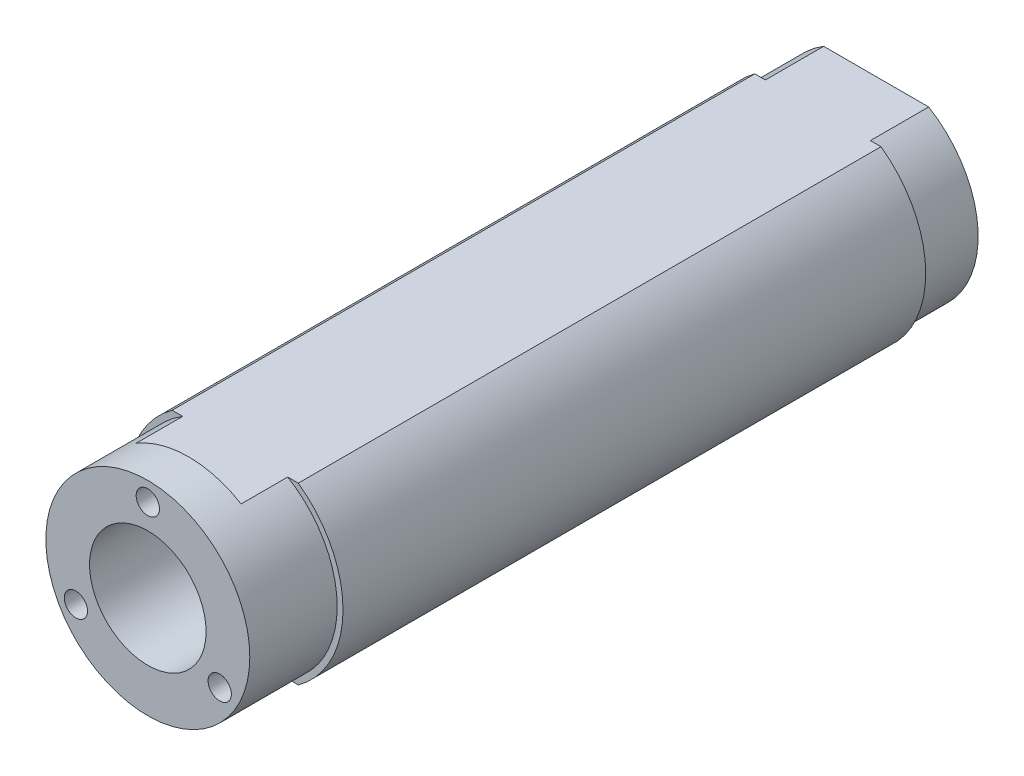
ISO-10303-21;
HEADER;
FILE_DESCRIPTION(('STEP AP214'),'2;1');
FILE_NAME('part.step','',(''),(''),'','','');
FILE_SCHEMA(('AUTOMOTIVE_DESIGN { 1 0 10303 214 1 1 1 1 }'));
ENDSEC;
DATA;
#1=APPLICATION_CONTEXT('core data for automotive mechanical design processes');
#2=APPLICATION_PROTOCOL_DEFINITION('international standard','automotive_design',2000,#1);
#3=PRODUCT_CONTEXT('',#1,'mechanical');
#4=PRODUCT('Part','Part','',(#3));
#5=PRODUCT_RELATED_PRODUCT_CATEGORY('part','',(#4));
#6=PRODUCT_DEFINITION_FORMATION('','',#4);
#7=PRODUCT_DEFINITION_CONTEXT('part definition',#1,'design');
#8=PRODUCT_DEFINITION('design','',#6,#7);
#9=PRODUCT_DEFINITION_SHAPE('','',#8);
#10=(LENGTH_UNIT() NAMED_UNIT(*) SI_UNIT(.MILLI.,.METRE.));
#11=(NAMED_UNIT(*) PLANE_ANGLE_UNIT() SI_UNIT($,.RADIAN.));
#12=(NAMED_UNIT(*) SI_UNIT($,.STERADIAN.) SOLID_ANGLE_UNIT());
#13=UNCERTAINTY_MEASURE_WITH_UNIT(LENGTH_MEASURE(1.E-05),#10,'distance_accuracy_value','');
#14=(GEOMETRIC_REPRESENTATION_CONTEXT(3) GLOBAL_UNCERTAINTY_ASSIGNED_CONTEXT((#13)) GLOBAL_UNIT_ASSIGNED_CONTEXT((#10,
#11,#12)) REPRESENTATION_CONTEXT('',''));
#15=CARTESIAN_POINT('',(0.,0.,0.));
#16=DIRECTION('',(0.,0.,1.));
#17=DIRECTION('',(1.,0.,0.));
#18=AXIS2_PLACEMENT_3D('',#15,#16,#17);
#19=CARTESIAN_POINT('',(0.,15.,-60.));
#20=DIRECTION('',(0.,-1.,0.));
#21=DIRECTION('',(0.,0.,-1.));
#22=AXIS2_PLACEMENT_3D('',#19,#20,#21);
#23=PLANE('',#22);
#24=DIRECTION('',(-1.,0.,0.));
#25=VECTOR('',#24,1.);
#26=CARTESIAN_POINT('',(0.,15.,58.));
#27=LINE('',#26,#25);
#28=CARTESIAN_POINT('',(9.01387818865998,15.,58.));
#29=VERTEX_POINT('',#28);
#30=CARTESIAN_POINT('',(-9.01387818865998,15.,58.));
#31=VERTEX_POINT('',#30);
#32=EDGE_CURVE('E65',#29,#31,#27,.T.);
#33=ORIENTED_EDGE('',*,*,#32,.F.);
#34=DIRECTION('',(0.,0.,1.));
#35=VECTOR('',#34,1.);
#36=CARTESIAN_POINT('',(9.01387818865998,15.,-60.));
#37=LINE('',#36,#35);
#38=CARTESIAN_POINT('',(9.01387818865998,15.,50.));
#39=VERTEX_POINT('',#38);
#40=EDGE_CURVE('E57',#39,#29,#37,.T.);
#41=ORIENTED_EDGE('',*,*,#40,.F.);
#42=DIRECTION('',(1.,0.,0.));
#43=VECTOR('',#42,1.);
#44=CARTESIAN_POINT('',(0.,15.,50.));
#45=LINE('',#44,#43);
#46=CARTESIAN_POINT('',(10.8282039138539,15.,50.));
#47=VERTEX_POINT('',#46);
#48=EDGE_CURVE('E206',#39,#47,#45,.T.);
#49=ORIENTED_EDGE('',*,*,#48,.T.);
#50=DIRECTION('',(0.,0.,1.));
#51=VECTOR('',#50,1.);
#52=CARTESIAN_POINT('',(10.8282039138539,15.,-50.));
#53=LINE('',#52,#51);
#54=CARTESIAN_POINT('',(10.8282039138539,15.,-50.));
#55=VERTEX_POINT('',#54);
#56=EDGE_CURVE('E189',#55,#47,#53,.T.);
#57=ORIENTED_EDGE('',*,*,#56,.F.);
#58=DIRECTION('',(1.,0.,0.));
#59=VECTOR('',#58,1.);
#60=CARTESIAN_POINT('',(0.,15.,-50.));
#61=LINE('',#60,#59);
#62=CARTESIAN_POINT('',(9.01387818865998,15.,-50.));
#63=VERTEX_POINT('',#62);
#64=EDGE_CURVE('E195',#63,#55,#61,.T.);
#65=ORIENTED_EDGE('',*,*,#64,.F.);
#66=CARTESIAN_POINT('',(9.01387818865998,15.,-60.));
#67=VERTEX_POINT('',#66);
#68=EDGE_CURVE('E11',#67,#63,#37,.T.);
#69=ORIENTED_EDGE('',*,*,#68,.F.);
#70=DIRECTION('',(1.,0.,0.));
#71=VECTOR('',#70,1.);
#72=CARTESIAN_POINT('',(0.,15.,-60.));
#73=LINE('',#72,#71);
#74=CARTESIAN_POINT('',(-9.01387818865998,15.,-60.));
#75=VERTEX_POINT('',#74);
#76=EDGE_CURVE('E178',#75,#67,#73,.T.);
#77=ORIENTED_EDGE('',*,*,#76,.F.);
#78=DIRECTION('',(0.,0.,1.));
#79=VECTOR('',#78,1.);
#80=CARTESIAN_POINT('',(-9.01387818865998,15.,-60.));
#81=LINE('',#80,#79);
#82=CARTESIAN_POINT('',(-9.01387818865998,15.,-50.));
#83=VERTEX_POINT('',#82);
#84=EDGE_CURVE('E161',#75,#83,#81,.T.);
#85=ORIENTED_EDGE('',*,*,#84,.T.);
#86=DIRECTION('',(1.,0.,0.));
#87=VECTOR('',#86,1.);
#88=CARTESIAN_POINT('',(0.,15.,-50.));
#89=LINE('',#88,#87);
#90=CARTESIAN_POINT('',(-10.8282039138539,15.,-50.));
#91=VERTEX_POINT('',#90);
#92=EDGE_CURVE('E234',#91,#83,#89,.T.);
#93=ORIENTED_EDGE('',*,*,#92,.F.);
#94=DIRECTION('',(0.,0.,-1.));
#95=VECTOR('',#94,1.);
#96=CARTESIAN_POINT('',(-10.8282039138539,15.,50.));
#97=LINE('',#96,#95);
#98=CARTESIAN_POINT('',(-10.8282039138539,15.,50.));
#99=VERTEX_POINT('',#98);
#100=EDGE_CURVE('E215',#99,#91,#97,.T.);
#101=ORIENTED_EDGE('',*,*,#100,.F.);
#102=DIRECTION('',(1.,0.,0.));
#103=VECTOR('',#102,1.);
#104=CARTESIAN_POINT('',(0.,15.,50.));
#105=LINE('',#104,#103);
#106=CARTESIAN_POINT('',(-9.01387818865998,15.,50.));
#107=VERTEX_POINT('',#106);
#108=EDGE_CURVE('E224',#99,#107,#105,.T.);
#109=ORIENTED_EDGE('',*,*,#108,.T.);
#110=EDGE_CURVE('E70',#107,#31,#81,.T.);
#111=ORIENTED_EDGE('',*,*,#110,.T.);
#112=EDGE_LOOP('',(#33,#41,#49,#57,#65,#69,#77,#85,#93,#101,#109,#111));
#113=FACE_BOUND('',#112,.T.);
#114=ADVANCED_FACE('F43',(#113),#23,.F.);
#115=CARTESIAN_POINT('',(0.,-15.,-60.));
#116=DIRECTION('',(0.,-1.,0.));
#117=DIRECTION('',(1.,0.,0.));
#118=AXIS2_PLACEMENT_3D('',#115,#116,#117);
#119=PLANE('',#118);
#120=CARTESIAN_POINT('',(0.,-15.,0.));
#121=DIRECTION('',(0.,-1.,0.));
#122=DIRECTION('',(0.,0.,-1.));
#123=AXIS2_PLACEMENT_3D('',#120,#121,#122);
#124=CIRCLE('',#123,1.525);
#125=CARTESIAN_POINT('',(0.,-15.,-1.525));
#126=VERTEX_POINT('',#125);
#127=EDGE_CURVE('E258',#126,#126,#124,.T.);
#128=ORIENTED_EDGE('',*,*,#127,.F.);
#129=EDGE_LOOP('',(#128));
#130=FACE_BOUND('',#129,.T.);
#131=DIRECTION('',(0.,0.,1.));
#132=VECTOR('',#131,1.);
#133=CARTESIAN_POINT('',(9.01387818865999,-15.,-60.));
#134=LINE('',#133,#132);
#135=CARTESIAN_POINT('',(9.01387818865999,-15.,50.));
#136=VERTEX_POINT('',#135);
#137=CARTESIAN_POINT('',(9.01387818865999,-15.,58.));
#138=VERTEX_POINT('',#137);
#139=EDGE_CURVE('E154',#136,#138,#134,.T.);
#140=ORIENTED_EDGE('',*,*,#139,.T.);
#141=DIRECTION('',(-1.,0.,0.));
#142=VECTOR('',#141,1.);
#143=CARTESIAN_POINT('',(0.,-15.,58.));
#144=LINE('',#143,#142);
#145=CARTESIAN_POINT('',(-9.01387818865998,-15.,58.));
#146=VERTEX_POINT('',#145);
#147=EDGE_CURVE('E140',#138,#146,#144,.T.);
#148=ORIENTED_EDGE('',*,*,#147,.T.);
#149=DIRECTION('',(0.,0.,1.));
#150=VECTOR('',#149,1.);
#151=CARTESIAN_POINT('',(-9.01387818865998,-15.,-60.));
#152=LINE('',#151,#150);
#153=CARTESIAN_POINT('',(-9.01387818865998,-15.,50.));
#154=VERTEX_POINT('',#153);
#155=EDGE_CURVE('E152',#154,#146,#152,.T.);
#156=ORIENTED_EDGE('',*,*,#155,.F.);
#157=DIRECTION('',(1.,0.,0.));
#158=VECTOR('',#157,1.);
#159=CARTESIAN_POINT('',(0.,-15.,50.));
#160=LINE('',#159,#158);
#161=CARTESIAN_POINT('',(-10.8282039138539,-15.,50.));
#162=VERTEX_POINT('',#161);
#163=EDGE_CURVE('E220',#162,#154,#160,.T.);
#164=ORIENTED_EDGE('',*,*,#163,.F.);
#165=DIRECTION('',(0.,0.,-1.));
#166=VECTOR('',#165,1.);
#167=CARTESIAN_POINT('',(-10.8282039138539,-15.,50.));
#168=LINE('',#167,#166);
#169=CARTESIAN_POINT('',(-10.8282039138539,-15.,-50.));
#170=VERTEX_POINT('',#169);
#171=EDGE_CURVE('E217',#162,#170,#168,.T.);
#172=ORIENTED_EDGE('',*,*,#171,.T.);
#173=DIRECTION('',(1.,0.,0.));
#174=VECTOR('',#173,1.);
#175=CARTESIAN_POINT('',(0.,-15.,-50.));
#176=LINE('',#175,#174);
#177=CARTESIAN_POINT('',(-9.01387818865998,-15.,-50.));
#178=VERTEX_POINT('',#177);
#179=EDGE_CURVE('E228',#170,#178,#176,.T.);
#180=ORIENTED_EDGE('',*,*,#179,.T.);
#181=CARTESIAN_POINT('',(-9.01387818865998,-15.,-60.));
#182=VERTEX_POINT('',#181);
#183=EDGE_CURVE('E160',#182,#178,#152,.T.);
#184=ORIENTED_EDGE('',*,*,#183,.F.);
#185=DIRECTION('',(1.,0.,0.));
#186=VECTOR('',#185,1.);
#187=CARTESIAN_POINT('',(0.,-15.,-60.));
#188=LINE('',#187,#186);
#189=CARTESIAN_POINT('',(9.01387818865999,-15.,-60.));
#190=VERTEX_POINT('',#189);
#191=EDGE_CURVE('E172',#182,#190,#188,.T.);
#192=ORIENTED_EDGE('',*,*,#191,.T.);
#193=CARTESIAN_POINT('',(9.01387818865999,-15.,-50.));
#194=VERTEX_POINT('',#193);
#195=EDGE_CURVE('E166',#190,#194,#134,.T.);
#196=ORIENTED_EDGE('',*,*,#195,.T.);
#197=DIRECTION('',(1.,0.,0.));
#198=VECTOR('',#197,1.);
#199=CARTESIAN_POINT('',(0.,-15.,-50.));
#200=LINE('',#199,#198);
#201=CARTESIAN_POINT('',(10.8282039138539,-15.,-50.));
#202=VERTEX_POINT('',#201);
#203=EDGE_CURVE('E200',#194,#202,#200,.T.);
#204=ORIENTED_EDGE('',*,*,#203,.T.);
#205=DIRECTION('',(0.,0.,1.));
#206=VECTOR('',#205,1.);
#207=CARTESIAN_POINT('',(10.8282039138539,-15.,-50.));
#208=LINE('',#207,#206);
#209=CARTESIAN_POINT('',(10.8282039138539,-15.,50.));
#210=VERTEX_POINT('',#209);
#211=EDGE_CURVE('E190',#202,#210,#208,.T.);
#212=ORIENTED_EDGE('',*,*,#211,.T.);
#213=DIRECTION('',(1.,0.,0.));
#214=VECTOR('',#213,1.);
#215=CARTESIAN_POINT('',(0.,-15.,50.));
#216=LINE('',#215,#214);
#217=EDGE_CURVE('E212',#136,#210,#216,.T.);
#218=ORIENTED_EDGE('',*,*,#217,.F.);
#219=EDGE_LOOP('',(#140,#148,#156,#164,#172,#180,#184,#192,#196,#204,#212,#218));
#220=FACE_BOUND('',#219,.T.);
#221=ADVANCED_FACE('F150',(#130,#220),#119,.T.);
#222=CARTESIAN_POINT('',(0.,0.,-60.));
#223=DIRECTION('',(0.,0.,1.));
#224=DIRECTION('',(1.,0.,0.));
#225=AXIS2_PLACEMENT_3D('',#222,#223,#224);
#226=CYLINDRICAL_SURFACE('',#225,17.5);
#227=ORIENTED_EDGE('',*,*,#183,.T.);
#228=CARTESIAN_POINT('',(0.,0.,-50.));
#229=DIRECTION('',(0.,0.,1.));
#230=DIRECTION('',(1.,0.,0.));
#231=AXIS2_PLACEMENT_3D('',#228,#229,#230);
#232=CIRCLE('',#231,17.5);
#233=EDGE_CURVE('E226',#83,#178,#232,.T.);
#234=ORIENTED_EDGE('',*,*,#233,.F.);
#235=ORIENTED_EDGE('',*,*,#84,.F.);
#236=CARTESIAN_POINT('',(0.,0.,-60.));
#237=DIRECTION('',(0.,0.,1.));
#238=DIRECTION('',(1.,0.,0.));
#239=AXIS2_PLACEMENT_3D('',#236,#237,#238);
#240=CIRCLE('',#239,17.5);
#241=EDGE_CURVE('E175',#75,#182,#240,.T.);
#242=ORIENTED_EDGE('',*,*,#241,.T.);
#243=EDGE_LOOP('',(#227,#234,#235,#242));
#244=FACE_BOUND('',#243,.T.);
#245=ADVANCED_FACE('F265',(#244),#226,.T.);
#246=ORIENTED_EDGE('',*,*,#68,.T.);
#247=CARTESIAN_POINT('',(0.,0.,-50.));
#248=DIRECTION('',(0.,0.,1.));
#249=DIRECTION('',(1.,0.,0.));
#250=AXIS2_PLACEMENT_3D('',#247,#248,#249);
#251=CIRCLE('',#250,17.5);
#252=EDGE_CURVE('E192',#194,#63,#251,.T.);
#253=ORIENTED_EDGE('',*,*,#252,.F.);
#254=ORIENTED_EDGE('',*,*,#195,.F.);
#255=CARTESIAN_POINT('',(0.,0.,-60.));
#256=DIRECTION('',(0.,0.,1.));
#257=DIRECTION('',(1.,0.,0.));
#258=AXIS2_PLACEMENT_3D('',#255,#256,#257);
#259=CIRCLE('',#258,17.5);
#260=EDGE_CURVE('E169',#190,#67,#259,.T.);
#261=ORIENTED_EDGE('',*,*,#260,.T.);
#262=EDGE_LOOP('',(#246,#253,#254,#261));
#263=FACE_BOUND('',#262,.T.);
#264=ADVANCED_FACE('F271',(#263),#226,.T.);
#265=CARTESIAN_POINT('',(0.,0.,65.));
#266=DIRECTION('',(0.,0.,1.));
#267=DIRECTION('',(1.,0.,0.));
#268=AXIS2_PLACEMENT_3D('',#265,#266,#267);
#269=CIRCLE('',#268,17.5);
#270=CARTESIAN_POINT('',(17.5,0.,65.));
#271=VERTEX_POINT('',#270);
#272=EDGE_CURVE('E183',#271,#271,#269,.T.);
#273=ORIENTED_EDGE('',*,*,#272,.F.);
#274=EDGE_LOOP('',(#273));
#275=FACE_BOUND('',#274,.T.);
#276=CARTESIAN_POINT('',(0.,0.,58.));
#277=DIRECTION('',(0.,0.,1.));
#278=DIRECTION('',(1.,0.,0.));
#279=AXIS2_PLACEMENT_3D('',#276,#277,#278);
#280=CIRCLE('',#279,17.5);
#281=EDGE_CURVE('E137',#146,#138,#280,.T.);
#282=ORIENTED_EDGE('',*,*,#281,.T.);
#283=ORIENTED_EDGE('',*,*,#139,.F.);
#284=CARTESIAN_POINT('',(0.,0.,50.));
#285=DIRECTION('',(0.,0.,1.));
#286=DIRECTION('',(1.,0.,0.));
#287=AXIS2_PLACEMENT_3D('',#284,#285,#286);
#288=CIRCLE('',#287,17.5);
#289=EDGE_CURVE('E203',#136,#39,#288,.T.);
#290=ORIENTED_EDGE('',*,*,#289,.T.);
#291=ORIENTED_EDGE('',*,*,#40,.T.);
#292=EDGE_CURVE('E145',#29,#31,#280,.T.);
#293=ORIENTED_EDGE('',*,*,#292,.T.);
#294=ORIENTED_EDGE('',*,*,#110,.F.);
#295=CARTESIAN_POINT('',(0.,0.,50.));
#296=DIRECTION('',(0.,0.,1.));
#297=DIRECTION('',(1.,0.,0.));
#298=AXIS2_PLACEMENT_3D('',#295,#296,#297);
#299=CIRCLE('',#298,17.5);
#300=EDGE_CURVE('E159',#107,#154,#299,.T.);
#301=ORIENTED_EDGE('',*,*,#300,.T.);
#302=ORIENTED_EDGE('',*,*,#155,.T.);
#303=EDGE_LOOP('',(#282,#283,#290,#291,#293,#294,#301,#302));
#304=FACE_BOUND('',#303,.T.);
#305=ADVANCED_FACE('F157',(#275,#304),#226,.T.);
#306=CARTESIAN_POINT('',(0.,0.,-60.));
#307=DIRECTION('',(0.,0.,1.));
#308=DIRECTION('',(1.,0.,0.));
#309=AXIS2_PLACEMENT_3D('',#306,#307,#308);
#310=CYLINDRICAL_SURFACE('',#309,10.);
#311=CARTESIAN_POINT('',(0.,-10.,-1.25));
#312=CARTESIAN_POINT('',(0.069920547777883,-9.99999902448215,-1.24999702953214));
#313=CARTESIAN_POINT('',(0.139884787151376,-9.99925892277451,-1.24411356041536));
#314=CARTESIAN_POINT('',(0.277866401044878,-9.9963777005568,-1.2207361227146));
#315=CARTESIAN_POINT('',(0.345881665311874,-9.99423511720715,-1.2032300310383));
#316=CARTESIAN_POINT('',(0.477947787406529,-9.98879030522203,-1.15713117804296));
#317=CARTESIAN_POINT('',(0.542001280073071,-9.98548885727771,-1.12854587909507));
#318=CARTESIAN_POINT('',(0.66438973744652,-9.97809350439049,-1.0611163580151));
#319=CARTESIAN_POINT('',(0.722725680778187,-9.97399973542058,-1.02227389573464));
#320=CARTESIAN_POINT('',(0.83235640846566,-9.96545160653163,-0.935204025080203));
#321=CARTESIAN_POINT('',(0.883615182468564,-9.96099557346209,-0.886931435326879));
#322=CARTESIAN_POINT('',(0.977326396778748,-9.95223863004875,-0.782468588231678));
#323=CARTESIAN_POINT('',(1.01977838819613,-9.94793772762134,-0.726277927543376));
#324=CARTESIAN_POINT('',(1.09480508064197,-9.93996152809793,-0.607340011217166));
#325=CARTESIAN_POINT('',(1.12734604797054,-9.93628838588956,-0.544571319216027));
#326=CARTESIAN_POINT('',(1.18141153828756,-9.93000564228841,-0.414406474026319));
#327=CARTESIAN_POINT('',(1.20293647903261,-9.92739600056568,-0.347010496426492));
#328=CARTESIAN_POINT('',(1.23424949001238,-9.92355169801807,-0.209877902206617));
#329=CARTESIAN_POINT('',(1.24409835736585,-9.92230991718372,-0.140155371147902));
#330=CARTESIAN_POINT('',(1.25196777477862,-9.92132014071396,-3.6868264083025E-05));
#331=CARTESIAN_POINT('',(1.24998880050121,-9.92157208500754,0.0703590763656457));
#332=CARTESIAN_POINT('',(1.23430861822395,-9.92353477684876,0.209402413624391));
#333=CARTESIAN_POINT('',(1.22067438149235,-9.92523718980165,0.278057493100132));
#334=CARTESIAN_POINT('',(1.18217519159103,-9.92989599878815,0.412097510609493));
#335=CARTESIAN_POINT('',(1.15731001087595,-9.93285242022862,0.477482382357019));
#336=CARTESIAN_POINT('',(1.09698277995583,-9.93969557932326,0.603333999510842));
#337=CARTESIAN_POINT('',(1.06149162685382,-9.94358486605722,0.663786650124492));
#338=CARTESIAN_POINT('',(0.98094073472846,-9.95185355715299,0.777903347206623));
#339=CARTESIAN_POINT('',(0.935880558040389,-9.95623298392831,0.83156708298684));
#340=CARTESIAN_POINT('',(0.837099555376891,-9.96502554945213,0.93097135536137));
#341=CARTESIAN_POINT('',(0.783321003920007,-9.96943871193445,0.97665454588299));
#342=CARTESIAN_POINT('',(0.668828584556963,-9.97777316277927,1.05835444001527));
#343=CARTESIAN_POINT('',(0.608114700659127,-9.98169445000753,1.094371121336));
#344=CARTESIAN_POINT('',(0.481430835681742,-9.9886057610929,1.15571566023196));
#345=CARTESIAN_POINT('',(0.41545909766886,-9.99159547200768,1.18103992694061));
#346=CARTESIAN_POINT('',(0.28015397021553,-9.99630392890031,1.22023524676163));
#347=CARTESIAN_POINT('',(0.210820738315335,-9.99802273437935,1.23410683606852));
#348=CARTESIAN_POINT('',(0.0712565819567505,-9.9999879820538,1.24992871213027));
#349=CARTESIAN_POINT('',(0.00103474509930558,-10.0002441807132,1.25195799618203));
#350=CARTESIAN_POINT('',(-0.138748018248746,-9.99928169002715,1.24424613297202));
#351=CARTESIAN_POINT('',(-0.208308958782351,-9.99806303209107,1.2345052363742));
#352=CARTESIAN_POINT('',(-0.344562253860759,-9.99429384378346,1.20359514561281));
#353=CARTESIAN_POINT('',(-0.41126328521235,-9.99174770406934,1.18246361829868));
#354=CARTESIAN_POINT('',(-0.540174827429201,-9.98560861550099,1.12941127404354));
#355=CARTESIAN_POINT('',(-0.602385185732654,-9.98201563110312,1.09749009075428));
#356=CARTESIAN_POINT('',(-0.720902260343711,-9.97415911455056,1.02357343124627));
#357=CARTESIAN_POINT('',(-0.777176879971907,-9.96989222021254,0.981526855097181));
#358=CARTESIAN_POINT('',(-0.881898494813156,-9.96117571162828,0.888625251232897));
#359=CARTESIAN_POINT('',(-0.930345179168426,-9.95672609013449,0.837769873874504));
#360=CARTESIAN_POINT('',(-1.018315979409,-9.94811552731292,0.728346291621429));
#361=CARTESIAN_POINT('',(-1.05778773028396,-9.94395637360664,0.669735826844802));
#362=CARTESIAN_POINT('',(-1.12632644472175,-9.93642705518574,0.546670877572644));
#363=CARTESIAN_POINT('',(-1.15539361686418,-9.93305687465514,0.48221651026174));
#364=CARTESIAN_POINT('',(-1.20221328943327,-9.92749925196498,0.349462340426193));
#365=CARTESIAN_POINT('',(-1.21999531372855,-9.92530872592394,0.281173084976014));
#366=CARTESIAN_POINT('',(-1.24383499693392,-9.92234957953728,0.142548758109667));
#367=CARTESIAN_POINT('',(-1.24989320126788,-9.92158089304389,0.072213782020499));
#368=CARTESIAN_POINT('',(-1.25010326804241,-9.92155438491228,-0.0679844646023398));
#369=CARTESIAN_POINT('',(-1.24433739884963,-9.92228612375977,-0.137847624165945));
#370=CARTESIAN_POINT('',(-1.22123720242466,-9.92515557268601,-0.275603564672539));
#371=CARTESIAN_POINT('',(-1.20390287395288,-9.92729328291541,-0.343496345404398));
#372=CARTESIAN_POINT('',(-1.15818353684482,-9.93273057887275,-0.4753734783832));
#373=CARTESIAN_POINT('',(-1.12980249048546,-9.93602974796392,-0.539359222510907));
#374=CARTESIAN_POINT('',(-1.06280345107515,-9.9434189162241,-0.661673327024157));
#375=CARTESIAN_POINT('',(-1.02418532975479,-9.94750892530207,-0.720001616509913));
#376=CARTESIAN_POINT('',(-0.937503165632915,-9.95605302376117,-0.829765612670236));
#377=CARTESIAN_POINT('',(-0.889377812887475,-9.96050936042017,-0.881152730477488));
#378=CARTESIAN_POINT('',(-0.785175113484188,-9.9692641579645,-0.975153412583985));
#379=CARTESIAN_POINT('',(-0.72909589457078,-9.97356258137795,-1.01776490538716));
#380=CARTESIAN_POINT('',(-0.610332810427102,-9.98153528293373,-1.09314267855265));
#381=CARTESIAN_POINT('',(-0.547624639798082,-9.98520712539151,-1.12587090294963));
#382=CARTESIAN_POINT('',(-0.417591451150638,-9.99148824538363,-1.18028562145814));
#383=CARTESIAN_POINT('',(-0.350271540435115,-9.99409867684788,-1.20198411317673));
#384=CARTESIAN_POINT('',(-0.235502885983959,-9.99733360163873,-1.22852966908565));
#385=CARTESIAN_POINT('',(-0.188777831758457,-9.99832862947727,-1.23656947099103));
#386=CARTESIAN_POINT('',(-0.0947085316062148,-9.99966215664594,-1.24730562284661));
#387=CARTESIAN_POINT('',(-0.0473642902480111,-10.0000006608173,-1.25000201219965));
#388=CARTESIAN_POINT('',(0.,-10.,-1.25));
#389=B_SPLINE_CURVE_WITH_KNOTS('',3,(#311,#312,#313,#314,#315,#316,#317,#318,#319,#320,#321,
#322,#323,#324,#325,#326,#327,#328,#329,#330,#331,#332,#333,#334,#335,#336,#337,#338,#339,#340,
#341,#342,#343,#344,#345,#346,#347,#348,#349,#350,#351,#352,#353,#354,#355,#356,#357,#358,#359,
#360,#361,#362,#363,#364,#365,#366,#367,#368,#369,#370,#371,#372,#373,#374,#375,#376,#377,#378,
#379,#380,#381,#382,#383,#384,#385,#386,#387,#388),.UNSPECIFIED.,.T.,.F.,(4,2,2,2,2,2,2,2,2,2,2,
2,2,2,2,2,2,2,2,2,2,2,2,2,2,2,2,2,2,2,2,2,2,2,2,2,2,2,4),(0.,0.209588636388123,
0.419396230471713,0.629062754090885,0.838693327955365,1.04935406600921,1.26002553900005,
1.47140625159435,1.68277894748403,1.8930461264316,2.10330484942332,2.31236348220846,
2.5214263508312,2.73106713142766,2.94071750256819,3.15181739068208,3.36291776556556,
3.57408897865802,3.7852503045189,3.9950013969596,4.20474802250964,4.41380526946697,
4.62286961539473,4.83301201464211,5.04316275687544,5.25450985753786,5.46585272110769,
5.67664037140462,5.88741821505311,6.09673450601107,6.30605081939774,6.51529212353243,
6.72453604956131,6.93517618845914,7.14586599235006,7.35735701518426,7.56861749342016,
7.71059421593814,7.85256989150218),.UNSPECIFIED.);
#390=CARTESIAN_POINT('',(0.,-10.,-1.25));
#391=VERTEX_POINT('',#390);
#392=EDGE_CURVE('E48',#391,#391,#389,.T.);
#393=ORIENTED_EDGE('',*,*,#392,.T.);
#394=EDGE_LOOP('',(#393));
#395=FACE_BOUND('',#394,.T.);
#396=CARTESIAN_POINT('',(0.,0.,65.));
#397=DIRECTION('',(0.,0.,1.));
#398=DIRECTION('',(1.,0.,0.));
#399=AXIS2_PLACEMENT_3D('',#396,#397,#398);
#400=CIRCLE('',#399,10.);
#401=CARTESIAN_POINT('',(10.,0.,65.));
#402=VERTEX_POINT('',#401);
#403=EDGE_CURVE('E186',#402,#402,#400,.T.);
#404=ORIENTED_EDGE('',*,*,#403,.T.);
#405=EDGE_LOOP('',(#404));
#406=FACE_BOUND('',#405,.T.);
#407=CARTESIAN_POINT('',(0.,0.,-60.));
#408=DIRECTION('',(0.,0.,1.));
#409=DIRECTION('',(1.,0.,0.));
#410=AXIS2_PLACEMENT_3D('',#407,#408,#409);
#411=CIRCLE('',#410,10.);
#412=CARTESIAN_POINT('',(10.,0.,-60.));
#413=VERTEX_POINT('',#412);
#414=EDGE_CURVE('E180',#413,#413,#411,.T.);
#415=ORIENTED_EDGE('',*,*,#414,.F.);
#416=EDGE_LOOP('',(#415));
#417=FACE_BOUND('',#416,.T.);
#418=ADVANCED_FACE('F45',(#395,#406,#417),#310,.F.);
#419=CARTESIAN_POINT('',(0.,0.,-60.));
#420=DIRECTION('',(0.,0.,1.));
#421=DIRECTION('',(1.,0.,0.));
#422=AXIS2_PLACEMENT_3D('',#419,#420,#421);
#423=PLANE('',#422);
#424=ORIENTED_EDGE('',*,*,#414,.T.);
#425=EDGE_LOOP('',(#424));
#426=FACE_BOUND('',#425,.T.);
#427=ORIENTED_EDGE('',*,*,#76,.T.);
#428=ORIENTED_EDGE('',*,*,#260,.F.);
#429=ORIENTED_EDGE('',*,*,#191,.F.);
#430=ORIENTED_EDGE('',*,*,#241,.F.);
#431=EDGE_LOOP('',(#427,#428,#429,#430));
#432=FACE_BOUND('',#431,.T.);
#433=ADVANCED_FACE('F277',(#426,#432),#423,.F.);
#434=CARTESIAN_POINT('',(0.,0.,65.));
#435=DIRECTION('',(0.,0.,1.));
#436=DIRECTION('',(1.,0.,0.));
#437=AXIS2_PLACEMENT_3D('',#434,#435,#436);
#438=PLANE('',#437);
#439=CARTESIAN_POINT('',(0.,14.25,65.));
#440=DIRECTION('',(0.,0.,1.));
#441=DIRECTION('',(1.,0.,0.));
#442=AXIS2_PLACEMENT_3D('',#439,#440,#441);
#443=CIRCLE('',#442,2.);
#444=CARTESIAN_POINT('',(2.,14.25,65.));
#445=VERTEX_POINT('',#444);
#446=EDGE_CURVE('E250',#445,#445,#443,.T.);
#447=ORIENTED_EDGE('',*,*,#446,.F.);
#448=EDGE_LOOP('',(#447));
#449=FACE_BOUND('',#448,.T.);
#450=CARTESIAN_POINT('',(12.3408620039298,-7.12499999999913,65.));
#451=DIRECTION('',(0.,0.,1.));
#452=DIRECTION('',(1.,0.,0.));
#453=AXIS2_PLACEMENT_3D('',#450,#451,#452);
#454=CIRCLE('',#453,2.00000000000126);
#455=CARTESIAN_POINT('',(14.340862003931,-7.12499999999913,65.));
#456=VERTEX_POINT('',#455);
#457=EDGE_CURVE('E244',#456,#456,#454,.T.);
#458=ORIENTED_EDGE('',*,*,#457,.F.);
#459=EDGE_LOOP('',(#458));
#460=FACE_BOUND('',#459,.T.);
#461=CARTESIAN_POINT('',(-12.3408620039267,-7.12500000000088,65.));
#462=DIRECTION('',(0.,0.,1.));
#463=DIRECTION('',(1.,0.,0.));
#464=AXIS2_PLACEMENT_3D('',#461,#462,#463);
#465=CIRCLE('',#464,2.00000000000184);
#466=CARTESIAN_POINT('',(-10.3408620039249,-7.12500000000088,65.));
#467=VERTEX_POINT('',#466);
#468=EDGE_CURVE('E238',#467,#467,#465,.T.);
#469=ORIENTED_EDGE('',*,*,#468,.F.);
#470=EDGE_LOOP('',(#469));
#471=FACE_BOUND('',#470,.T.);
#472=ORIENTED_EDGE('',*,*,#403,.F.);
#473=EDGE_LOOP('',(#472));
#474=FACE_BOUND('',#473,.T.);
#475=ORIENTED_EDGE('',*,*,#272,.T.);
#476=EDGE_LOOP('',(#475));
#477=FACE_BOUND('',#476,.T.);
#478=ADVANCED_FACE('F280',(#449,#460,#471,#474,#477),#438,.T.);
#479=CARTESIAN_POINT('',(0.,0.,-50.));
#480=DIRECTION('',(0.,0.,1.));
#481=DIRECTION('',(1.,0.,0.));
#482=AXIS2_PLACEMENT_3D('',#479,#480,#481);
#483=CYLINDRICAL_SURFACE('',#482,18.5);
#484=CARTESIAN_POINT('',(0.,0.,50.));
#485=DIRECTION('',(0.,0.,1.));
#486=DIRECTION('',(1.,0.,0.));
#487=AXIS2_PLACEMENT_3D('',#484,#485,#486);
#488=CIRCLE('',#487,18.5);
#489=EDGE_CURVE('E209',#210,#47,#488,.T.);
#490=ORIENTED_EDGE('',*,*,#489,.F.);
#491=ORIENTED_EDGE('',*,*,#211,.F.);
#492=CARTESIAN_POINT('',(0.,0.,-50.));
#493=DIRECTION('',(0.,0.,1.));
#494=DIRECTION('',(1.,0.,0.));
#495=AXIS2_PLACEMENT_3D('',#492,#493,#494);
#496=CIRCLE('',#495,18.5);
#497=EDGE_CURVE('E197',#202,#55,#496,.T.);
#498=ORIENTED_EDGE('',*,*,#497,.T.);
#499=ORIENTED_EDGE('',*,*,#56,.T.);
#500=EDGE_LOOP('',(#490,#491,#498,#499));
#501=FACE_BOUND('',#500,.T.);
#502=ADVANCED_FACE('F284',(#501),#483,.T.);
#503=CARTESIAN_POINT('',(0.,0.,-50.));
#504=DIRECTION('',(0.,0.,1.));
#505=DIRECTION('',(1.,0.,0.));
#506=AXIS2_PLACEMENT_3D('',#503,#504,#505);
#507=PLANE('',#506);
#508=ORIENTED_EDGE('',*,*,#203,.F.);
#509=ORIENTED_EDGE('',*,*,#252,.T.);
#510=ORIENTED_EDGE('',*,*,#64,.T.);
#511=ORIENTED_EDGE('',*,*,#497,.F.);
#512=EDGE_LOOP('',(#508,#509,#510,#511));
#513=FACE_BOUND('',#512,.T.);
#514=ADVANCED_FACE('F288',(#513),#507,.F.);
#515=CARTESIAN_POINT('',(0.,0.,50.));
#516=DIRECTION('',(0.,0.,1.));
#517=DIRECTION('',(1.,0.,0.));
#518=AXIS2_PLACEMENT_3D('',#515,#516,#517);
#519=PLANE('',#518);
#520=ORIENTED_EDGE('',*,*,#217,.T.);
#521=ORIENTED_EDGE('',*,*,#489,.T.);
#522=ORIENTED_EDGE('',*,*,#48,.F.);
#523=ORIENTED_EDGE('',*,*,#289,.F.);
#524=EDGE_LOOP('',(#520,#521,#522,#523));
#525=FACE_BOUND('',#524,.T.);
#526=ADVANCED_FACE('F292',(#525),#519,.T.);
#527=CARTESIAN_POINT('',(0.,0.,50.));
#528=DIRECTION('',(0.,0.,-1.));
#529=DIRECTION('',(-1.,0.,0.));
#530=AXIS2_PLACEMENT_3D('',#527,#528,#529);
#531=CYLINDRICAL_SURFACE('',#530,18.5);
#532=ORIENTED_EDGE('',*,*,#100,.T.);
#533=CARTESIAN_POINT('',(0.,0.,-50.));
#534=DIRECTION('',(0.,0.,1.));
#535=DIRECTION('',(1.,0.,0.));
#536=AXIS2_PLACEMENT_3D('',#533,#534,#535);
#537=CIRCLE('',#536,18.5);
#538=EDGE_CURVE('E231',#91,#170,#537,.T.);
#539=ORIENTED_EDGE('',*,*,#538,.T.);
#540=ORIENTED_EDGE('',*,*,#171,.F.);
#541=CARTESIAN_POINT('',(0.,0.,50.));
#542=DIRECTION('',(0.,0.,1.));
#543=DIRECTION('',(1.,0.,0.));
#544=AXIS2_PLACEMENT_3D('',#541,#542,#543);
#545=CIRCLE('',#544,18.5);
#546=EDGE_CURVE('E222',#99,#162,#545,.T.);
#547=ORIENTED_EDGE('',*,*,#546,.F.);
#548=EDGE_LOOP('',(#532,#539,#540,#547));
#549=FACE_BOUND('',#548,.T.);
#550=ADVANCED_FACE('F296',(#549),#531,.T.);
#551=CARTESIAN_POINT('',(0.,0.,50.));
#552=DIRECTION('',(0.,0.,1.));
#553=DIRECTION('',(1.,0.,0.));
#554=AXIS2_PLACEMENT_3D('',#551,#552,#553);
#555=PLANE('',#554);
#556=ORIENTED_EDGE('',*,*,#108,.F.);
#557=ORIENTED_EDGE('',*,*,#546,.T.);
#558=ORIENTED_EDGE('',*,*,#163,.T.);
#559=ORIENTED_EDGE('',*,*,#300,.F.);
#560=EDGE_LOOP('',(#556,#557,#558,#559));
#561=FACE_BOUND('',#560,.T.);
#562=ADVANCED_FACE('F300',(#561),#555,.T.);
#563=CARTESIAN_POINT('',(0.,0.,-50.));
#564=DIRECTION('',(0.,0.,1.));
#565=DIRECTION('',(1.,0.,0.));
#566=AXIS2_PLACEMENT_3D('',#563,#564,#565);
#567=PLANE('',#566);
#568=ORIENTED_EDGE('',*,*,#92,.T.);
#569=ORIENTED_EDGE('',*,*,#233,.T.);
#570=ORIENTED_EDGE('',*,*,#179,.F.);
#571=ORIENTED_EDGE('',*,*,#538,.F.);
#572=EDGE_LOOP('',(#568,#569,#570,#571));
#573=FACE_BOUND('',#572,.T.);
#574=ADVANCED_FACE('F304',(#573),#567,.F.);
#575=CARTESIAN_POINT('',(0.,0.,58.));
#576=DIRECTION('',(0.,0.,1.));
#577=DIRECTION('',(1.,0.,0.));
#578=AXIS2_PLACEMENT_3D('',#575,#576,#577);
#579=PLANE('',#578);
#580=ORIENTED_EDGE('',*,*,#147,.F.);
#581=ORIENTED_EDGE('',*,*,#281,.F.);
#582=EDGE_LOOP('',(#580,#581));
#583=FACE_BOUND('',#582,.T.);
#584=ADVANCED_FACE('F139',(#583),#579,.F.);
#585=ORIENTED_EDGE('',*,*,#292,.F.);
#586=ORIENTED_EDGE('',*,*,#32,.T.);
#587=EDGE_LOOP('',(#585,#586));
#588=FACE_BOUND('',#587,.T.);
#589=ADVANCED_FACE('F311',(#588),#579,.F.);
#590=CARTESIAN_POINT('',(-12.3408620039267,-7.12500000000088,60.));
#591=DIRECTION('',(0.,0.,1.));
#592=DIRECTION('',(1.,0.,0.));
#593=AXIS2_PLACEMENT_3D('',#590,#591,#592);
#594=CYLINDRICAL_SURFACE('',#593,2.00000000000184);
#595=CARTESIAN_POINT('',(-12.3408620039267,-7.12500000000088,60.));
#596=DIRECTION('',(0.,0.,1.));
#597=DIRECTION('',(1.,0.,0.));
#598=AXIS2_PLACEMENT_3D('',#595,#596,#597);
#599=CIRCLE('',#598,2.00000000000184);
#600=CARTESIAN_POINT('',(-10.3408620039249,-7.12500000000088,60.));
#601=VERTEX_POINT('',#600);
#602=EDGE_CURVE('E241',#601,#601,#599,.T.);
#603=ORIENTED_EDGE('',*,*,#602,.F.);
#604=EDGE_LOOP('',(#603));
#605=FACE_BOUND('',#604,.T.);
#606=ORIENTED_EDGE('',*,*,#468,.T.);
#607=EDGE_LOOP('',(#606));
#608=FACE_BOUND('',#607,.T.);
#609=ADVANCED_FACE('F312',(#605,#608),#594,.F.);
#610=CARTESIAN_POINT('',(-12.3408620039267,-7.12500000000088,60.));
#611=DIRECTION('',(0.,0.,1.));
#612=DIRECTION('',(1.,0.,0.));
#613=AXIS2_PLACEMENT_3D('',#610,#611,#612);
#614=PLANE('',#613);
#615=ORIENTED_EDGE('',*,*,#602,.T.);
#616=EDGE_LOOP('',(#615));
#617=FACE_BOUND('',#616,.T.);
#618=ADVANCED_FACE('F315',(#617),#614,.T.);
#619=CARTESIAN_POINT('',(12.3408620039298,-7.12499999999913,60.));
#620=DIRECTION('',(0.,0.,1.));
#621=DIRECTION('',(1.,0.,0.));
#622=AXIS2_PLACEMENT_3D('',#619,#620,#621);
#623=CYLINDRICAL_SURFACE('',#622,2.00000000000126);
#624=CARTESIAN_POINT('',(12.3408620039298,-7.12499999999913,60.));
#625=DIRECTION('',(0.,0.,1.));
#626=DIRECTION('',(1.,0.,0.));
#627=AXIS2_PLACEMENT_3D('',#624,#625,#626);
#628=CIRCLE('',#627,2.00000000000126);
#629=CARTESIAN_POINT('',(14.340862003931,-7.12499999999913,60.));
#630=VERTEX_POINT('',#629);
#631=EDGE_CURVE('E247',#630,#630,#628,.T.);
#632=ORIENTED_EDGE('',*,*,#631,.F.);
#633=EDGE_LOOP('',(#632));
#634=FACE_BOUND('',#633,.T.);
#635=ORIENTED_EDGE('',*,*,#457,.T.);
#636=EDGE_LOOP('',(#635));
#637=FACE_BOUND('',#636,.T.);
#638=ADVANCED_FACE('F319',(#634,#637),#623,.F.);
#639=CARTESIAN_POINT('',(12.3408620039298,-7.12499999999913,60.));
#640=DIRECTION('',(0.,0.,1.));
#641=DIRECTION('',(1.,0.,0.));
#642=AXIS2_PLACEMENT_3D('',#639,#640,#641);
#643=PLANE('',#642);
#644=ORIENTED_EDGE('',*,*,#631,.T.);
#645=EDGE_LOOP('',(#644));
#646=FACE_BOUND('',#645,.T.);
#647=ADVANCED_FACE('F323',(#646),#643,.T.);
#648=CARTESIAN_POINT('',(0.,14.25,60.));
#649=DIRECTION('',(0.,0.,1.));
#650=DIRECTION('',(1.,0.,0.));
#651=AXIS2_PLACEMENT_3D('',#648,#649,#650);
#652=CYLINDRICAL_SURFACE('',#651,2.);
#653=CARTESIAN_POINT('',(0.,14.25,60.));
#654=DIRECTION('',(0.,0.,1.));
#655=DIRECTION('',(1.,0.,0.));
#656=AXIS2_PLACEMENT_3D('',#653,#654,#655);
#657=CIRCLE('',#656,2.);
#658=CARTESIAN_POINT('',(2.,14.25,60.));
#659=VERTEX_POINT('',#658);
#660=EDGE_CURVE('E146',#659,#659,#657,.T.);
#661=ORIENTED_EDGE('',*,*,#660,.F.);
#662=EDGE_LOOP('',(#661));
#663=FACE_BOUND('',#662,.T.);
#664=ORIENTED_EDGE('',*,*,#446,.T.);
#665=EDGE_LOOP('',(#664));
#666=FACE_BOUND('',#665,.T.);
#667=ADVANCED_FACE('F327',(#663,#666),#652,.F.);
#668=CARTESIAN_POINT('',(0.,14.25,60.));
#669=DIRECTION('',(0.,0.,1.));
#670=DIRECTION('',(1.,0.,0.));
#671=AXIS2_PLACEMENT_3D('',#668,#669,#670);
#672=PLANE('',#671);
#673=ORIENTED_EDGE('',*,*,#660,.T.);
#674=EDGE_LOOP('',(#673));
#675=FACE_BOUND('',#674,.T.);
#676=ADVANCED_FACE('F331',(#675),#672,.T.);
#677=CARTESIAN_POINT('',(0.,-15.,0.));
#678=DIRECTION('',(0.,-1.,0.));
#679=DIRECTION('',(0.,0.,-1.));
#680=AXIS2_PLACEMENT_3D('',#677,#678,#679);
#681=CYLINDRICAL_SURFACE('',#680,1.25);
#682=CARTESIAN_POINT('',(0.,-14.725,0.));
#683=DIRECTION('',(0.,-1.,0.));
#684=DIRECTION('',(0.,0.,-1.));
#685=AXIS2_PLACEMENT_3D('',#682,#683,#684);
#686=CIRCLE('',#685,1.25);
#687=CARTESIAN_POINT('',(0.,-14.725,-1.25));
#688=VERTEX_POINT('',#687);
#689=EDGE_CURVE('E255',#688,#688,#686,.T.);
#690=ORIENTED_EDGE('',*,*,#689,.T.);
#691=EDGE_LOOP('',(#690));
#692=FACE_BOUND('',#691,.T.);
#693=ORIENTED_EDGE('',*,*,#392,.F.);
#694=EDGE_LOOP('',(#693));
#695=FACE_BOUND('',#694,.T.);
#696=ADVANCED_FACE('F334',(#692,#695),#681,.F.);
#697=CARTESIAN_POINT('',(0.,-15.,0.));
#698=DIRECTION('',(0.,-1.,0.));
#699=DIRECTION('',(0.,0.,-1.));
#700=AXIS2_PLACEMENT_3D('',#697,#698,#699);
#701=CONICAL_SURFACE('',#700,1.525,0.785398163397448);
#702=ORIENTED_EDGE('',*,*,#689,.F.);
#703=EDGE_LOOP('',(#702));
#704=FACE_BOUND('',#703,.T.);
#705=ORIENTED_EDGE('',*,*,#127,.T.);
#706=EDGE_LOOP('',(#705));
#707=FACE_BOUND('',#706,.T.);
#708=ADVANCED_FACE('F262',(#704,#707),#701,.F.);
#709=CLOSED_SHELL('',(#114,#221,#245,#264,#305,#418,#433,#478,#502,#514,#526,#550,#562,#574,
#584,#589,#609,#618,#638,#647,#667,#676,#696,#708));
#710=MANIFOLD_SOLID_BREP('B2',#709);
#711=ADVANCED_BREP_SHAPE_REPRESENTATION('',(#18,#710),#14);
#712=SHAPE_DEFINITION_REPRESENTATION(#9,#711);
ENDSEC;
END-ISO-10303-21;
